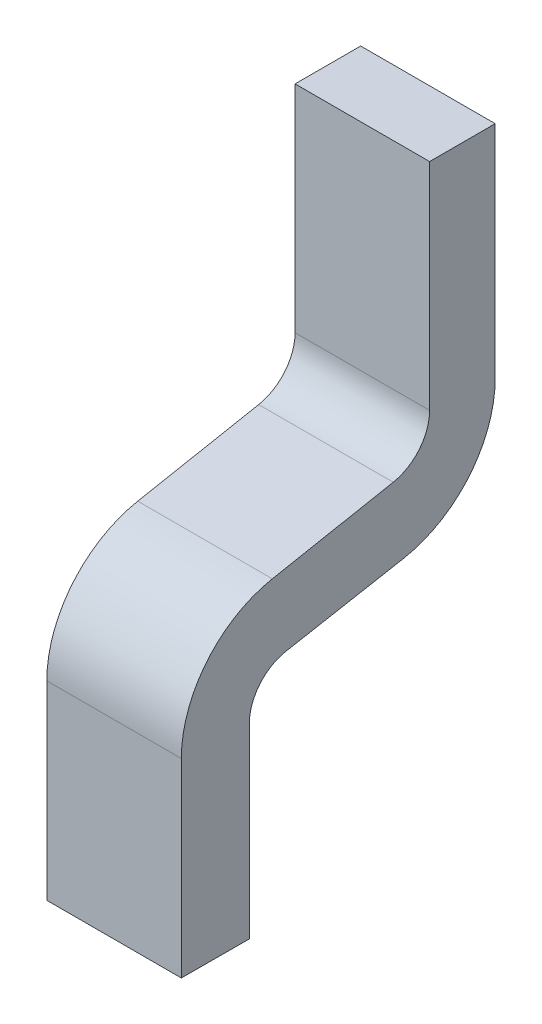
ISO-10303-21;
HEADER;
FILE_DESCRIPTION(('STEP AP214'),'2;1');
FILE_NAME('part.step','',(''),(''),'','','');
FILE_SCHEMA(('AUTOMOTIVE_DESIGN { 1 0 10303 214 1 1 1 1 }'));
ENDSEC;
DATA;
#1=APPLICATION_CONTEXT('core data for automotive mechanical design processes');
#2=APPLICATION_PROTOCOL_DEFINITION('international standard','automotive_design',2000,#1);
#3=PRODUCT_CONTEXT('',#1,'mechanical');
#4=PRODUCT('Part','Part','',(#3));
#5=PRODUCT_RELATED_PRODUCT_CATEGORY('part','',(#4));
#6=PRODUCT_DEFINITION_FORMATION('','',#4);
#7=PRODUCT_DEFINITION_CONTEXT('part definition',#1,'design');
#8=PRODUCT_DEFINITION('design','',#6,#7);
#9=PRODUCT_DEFINITION_SHAPE('','',#8);
#10=(LENGTH_UNIT() NAMED_UNIT(*) SI_UNIT(.MILLI.,.METRE.));
#11=(NAMED_UNIT(*) PLANE_ANGLE_UNIT() SI_UNIT($,.RADIAN.));
#12=(NAMED_UNIT(*) SI_UNIT($,.STERADIAN.) SOLID_ANGLE_UNIT());
#13=UNCERTAINTY_MEASURE_WITH_UNIT(LENGTH_MEASURE(1.E-05),#10,'distance_accuracy_value','');
#14=(GEOMETRIC_REPRESENTATION_CONTEXT(3) GLOBAL_UNCERTAINTY_ASSIGNED_CONTEXT((#13)) GLOBAL_UNIT_ASSIGNED_CONTEXT((#10,
#11,#12)) REPRESENTATION_CONTEXT('',''));
#15=CARTESIAN_POINT('',(0.,0.,0.));
#16=DIRECTION('',(0.,0.,1.));
#17=DIRECTION('',(1.,0.,0.));
#18=AXIS2_PLACEMENT_3D('',#15,#16,#17);
#19=CARTESIAN_POINT('',(-18.50784701318,-12.60762751016,-0.360872498583902));
#20=DIRECTION('',(1.,0.,0.));
#21=DIRECTION('',(0.,1.,0.));
#22=AXIS2_PLACEMENT_3D('',#19,#20,#21);
#23=PLANE('',#22);
#24=DIRECTION('',(0.,1.,0.));
#25=VECTOR('',#24,1.);
#26=CARTESIAN_POINT('',(-18.50784701319,-13.25000000001,0.));
#27=LINE('',#26,#25);
#28=CARTESIAN_POINT('',(-18.50784701318,-13.25,0.));
#29=VERTEX_POINT('',#28);
#30=CARTESIAN_POINT('',(-18.50784701318,-12.82603681334,0.));
#31=VERTEX_POINT('',#30);
#32=EDGE_CURVE('E39',#29,#31,#27,.T.);
#33=ORIENTED_EDGE('',*,*,#32,.F.);
#34=DIRECTION('',(0.,-0.00269129326266288,-0.999996378463729));
#35=VECTOR('',#34,1.);
#36=CARTESIAN_POINT('',(-18.50784701319,-13.25000000001,0.));
#37=LINE('',#36,#35);
#38=CARTESIAN_POINT('',(-18.50784701318,-13.25040851671,-0.151791423887201));
#39=VERTEX_POINT('',#38);
#40=EDGE_CURVE('E11',#29,#39,#37,.T.);
#41=ORIENTED_EDGE('',*,*,#40,.T.);
#42=DIRECTION('',(0.,-1.,0.));
#43=VECTOR('',#42,1.);
#44=CARTESIAN_POINT('',(-18.50784701319,-12.83394015019,-0.1517914238972));
#45=LINE('',#44,#43);
#46=CARTESIAN_POINT('',(-18.50784701318,-12.83394015018,-0.151791423887201));
#47=VERTEX_POINT('',#46);
#48=EDGE_CURVE('E194',#47,#39,#45,.T.);
#49=ORIENTED_EDGE('',*,*,#48,.F.);
#50=CARTESIAN_POINT('',(-18.50784701319,-12.83394015019,-0.251791423897203));
#51=DIRECTION('',(-1.,0.,0.));
#52=DIRECTION('',(0.,-1.00017763558392E-10,1.));
#53=AXIS2_PLACEMENT_3D('',#50,#51,#52);
#54=CIRCLE('',#53,0.10000000001);
#55=CARTESIAN_POINT('',(-18.50784701318,-12.73558330985,-0.2337378380948));
#56=VERTEX_POINT('',#55);
#57=EDGE_CURVE('E27',#47,#56,#54,.T.);
#58=ORIENTED_EDGE('',*,*,#57,.T.);
#59=DIRECTION('',(0.,0.180535857958628,-0.983568403310691));
#60=VECTOR('',#59,1.);
#61=CARTESIAN_POINT('',(-18.50784701319,-12.73558330986,-0.2337378381045));
#62=LINE('',#61,#60);
#63=CARTESIAN_POINT('',(-18.50784701318,-12.68760355188,-0.495133964482499));
#64=VERTEX_POINT('',#63);
#65=EDGE_CURVE('E214',#56,#64,#62,.T.);
#66=ORIENTED_EDGE('',*,*,#65,.T.);
#67=CARTESIAN_POINT('',(-18.50784701319,-12.44171145106,-0.450000000010001));
#68=DIRECTION('',(1.,0.,0.));
#69=DIRECTION('',(0.,-0.983568403309632,-0.180535857964399));
#70=AXIS2_PLACEMENT_3D('',#67,#68,#69);
#71=CIRCLE('',#70,0.250000000011641);
#72=CARTESIAN_POINT('',(-18.50784701318,-12.44171145105,-0.699999999999999));
#73=VERTEX_POINT('',#72);
#74=EDGE_CURVE('E20',#64,#73,#71,.T.);
#75=ORIENTED_EDGE('',*,*,#74,.T.);
#76=DIRECTION('',(0.,-1.,0.));
#77=VECTOR('',#76,1.);
#78=CARTESIAN_POINT('',(-18.50784701319,-11.95000000001,-0.700000000010002));
#79=LINE('',#78,#77);
#80=CARTESIAN_POINT('',(-18.50784701318,-11.95,-0.699999999999999));
#81=VERTEX_POINT('',#80);
#82=EDGE_CURVE('E144',#81,#73,#79,.T.);
#83=ORIENTED_EDGE('',*,*,#82,.F.);
#84=DIRECTION('',(0.,0.,-1.));
#85=VECTOR('',#84,1.);
#86=CARTESIAN_POINT('',(-18.50784701319,-11.95000000001,-0.553700885222302));
#87=LINE('',#86,#85);
#88=CARTESIAN_POINT('',(-18.50784701318,-11.95,-0.5537008852123));
#89=VERTEX_POINT('',#88);
#90=EDGE_CURVE('E125',#89,#81,#87,.T.);
#91=ORIENTED_EDGE('',*,*,#90,.F.);
#92=DIRECTION('',(0.,1.,0.));
#93=VECTOR('',#92,1.);
#94=CARTESIAN_POINT('',(-18.50784701319,-12.43058530158,-0.553700885222302));
#95=LINE('',#94,#93);
#96=CARTESIAN_POINT('',(-18.50784701318,-12.43058530157,-0.5537008852123));
#97=VERTEX_POINT('',#96);
#98=EDGE_CURVE('E133',#97,#89,#95,.T.);
#99=ORIENTED_EDGE('',*,*,#98,.F.);
#100=CARTESIAN_POINT('',(-18.50784701319,-12.43058530158,-0.4537008852223));
#101=DIRECTION('',(-1.,0.,0.));
#102=DIRECTION('',(0.,0.,-1.));
#103=AXIS2_PLACEMENT_3D('',#100,#101,#102);
#104=CIRCLE('',#103,0.10000000001);
#105=CARTESIAN_POINT('',(-18.50784701318,-12.52879504245,-0.472538262858001));
#106=VERTEX_POINT('',#105);
#107=EDGE_CURVE('E253',#97,#106,#104,.T.);
#108=ORIENTED_EDGE('',*,*,#107,.T.);
#109=DIRECTION('',(0.,-0.18837377648219,0.982097408780737));
#110=VECTOR('',#109,1.);
#111=CARTESIAN_POINT('',(-18.50784701319,-12.52879504246,-0.472538262867802));
#112=LINE('',#111,#110);
#113=CARTESIAN_POINT('',(-18.50784701318,-12.58051246114,-0.202906555886999));
#114=VERTEX_POINT('',#113);
#115=EDGE_CURVE('E180',#106,#114,#112,.T.);
#116=ORIENTED_EDGE('',*,*,#115,.T.);
#117=CARTESIAN_POINT('',(-18.50784701319,-12.82603681335,-0.250000000009999));
#118=DIRECTION('',(1.,0.,0.));
#119=DIRECTION('',(0.,0.982097408780527,0.188373776483282));
#120=AXIS2_PLACEMENT_3D('',#117,#118,#119);
#121=CIRCLE('',#120,0.250000000011705);
#122=EDGE_CURVE('E177',#114,#31,#121,.T.);
#123=ORIENTED_EDGE('',*,*,#122,.T.);
#124=EDGE_LOOP('',(#33,#41,#49,#58,#66,#75,#83,#91,#99,#108,#116,#123));
#125=FACE_BOUND('',#124,.T.);
#126=ADVANCED_FACE('F16',(#125),#23,.T.);
#127=CARTESIAN_POINT('',(-18.80784701318,-12.82603681334,-0.25));
#128=DIRECTION('',(1.,0.,0.));
#129=DIRECTION('',(0.,0.,-1.));
#130=AXIS2_PLACEMENT_3D('',#127,#128,#129);
#131=CYLINDRICAL_SURFACE('',#130,0.25);
#132=DIRECTION('',(1.,0.,0.));
#133=VECTOR('',#132,1.);
#134=CARTESIAN_POINT('',(-18.80784701319,-12.82603681335,0.));
#135=LINE('',#134,#133);
#136=CARTESIAN_POINT('',(-18.80784701318,-12.82603681334,0.));
#137=VERTEX_POINT('',#136);
#138=EDGE_CURVE('E181',#137,#31,#135,.T.);
#139=ORIENTED_EDGE('',*,*,#138,.T.);
#140=ORIENTED_EDGE('',*,*,#122,.F.);
#141=DIRECTION('',(-1.,-3.33570181025589E-11,3.3404665161552E-11));
#142=VECTOR('',#141,1.);
#143=CARTESIAN_POINT('',(-18.50784701319,-12.58051246115,-0.202906555896699));
#144=LINE('',#143,#142);
#145=CARTESIAN_POINT('',(-18.80784701318,-12.58051246114,-0.2029065558867));
#146=VERTEX_POINT('',#145);
#147=EDGE_CURVE('E185',#114,#146,#144,.T.);
#148=ORIENTED_EDGE('',*,*,#147,.T.);
#149=CARTESIAN_POINT('',(-18.80784701319,-12.82603681335,-0.250000000009999));
#150=DIRECTION('',(-1.,0.,0.));
#151=DIRECTION('',(0.,0.,1.));
#152=AXIS2_PLACEMENT_3D('',#149,#150,#151);
#153=CIRCLE('',#152,0.25000000001);
#154=EDGE_CURVE('E189',#137,#146,#153,.T.);
#155=ORIENTED_EDGE('',*,*,#154,.F.);
#156=EDGE_LOOP('',(#139,#140,#148,#155));
#157=FACE_BOUND('',#156,.T.);
#158=ADVANCED_FACE('F287',(#157),#131,.T.);
#159=CARTESIAN_POINT('',(-18.80784701318,-12.60762751016,-0.360872498583902));
#160=DIRECTION('',(1.,0.,0.));
#161=DIRECTION('',(0.,1.,0.));
#162=AXIS2_PLACEMENT_3D('',#159,#160,#161);
#163=PLANE('',#162);
#164=DIRECTION('',(0.,0.18837377648219,-0.982097408780737));
#165=VECTOR('',#164,1.);
#166=CARTESIAN_POINT('',(-18.80784701319,-12.58051246115,-0.202906555896699));
#167=LINE('',#166,#165);
#168=CARTESIAN_POINT('',(-18.80784701318,-12.52879504245,-0.4725382628578));
#169=VERTEX_POINT('',#168);
#170=EDGE_CURVE('E213',#146,#169,#167,.T.);
#171=ORIENTED_EDGE('',*,*,#170,.T.);
#172=CARTESIAN_POINT('',(-18.80784701319,-12.43058530158,-0.4537008852223));
#173=DIRECTION('',(1.,0.,0.));
#174=DIRECTION('',(0.,-0.982097408770884,-0.188373776533558));
#175=AXIS2_PLACEMENT_3D('',#172,#173,#174);
#176=CIRCLE('',#175,0.100000000011705);
#177=CARTESIAN_POINT('',(-18.80784701318,-12.43058530157,-0.5537008852123));
#178=VERTEX_POINT('',#177);
#179=EDGE_CURVE('E204',#169,#178,#176,.T.);
#180=ORIENTED_EDGE('',*,*,#179,.T.);
#181=DIRECTION('',(0.,1.,0.));
#182=VECTOR('',#181,1.);
#183=CARTESIAN_POINT('',(-18.80784701319,-12.43058530158,-0.553700885222302));
#184=LINE('',#183,#182);
#185=CARTESIAN_POINT('',(-18.80784701318,-11.95,-0.5537008852123));
#186=VERTEX_POINT('',#185);
#187=EDGE_CURVE('E201',#178,#186,#184,.T.);
#188=ORIENTED_EDGE('',*,*,#187,.T.);
#189=DIRECTION('',(0.,0.,-1.));
#190=VECTOR('',#189,1.);
#191=CARTESIAN_POINT('',(-18.80784701319,-11.95000000001,-0.553700885222302));
#192=LINE('',#191,#190);
#193=CARTESIAN_POINT('',(-18.80784701318,-11.95,-0.699999999999999));
#194=VERTEX_POINT('',#193);
#195=EDGE_CURVE('E150',#186,#194,#192,.T.);
#196=ORIENTED_EDGE('',*,*,#195,.T.);
#197=DIRECTION('',(0.,-1.,0.));
#198=VECTOR('',#197,1.);
#199=CARTESIAN_POINT('',(-18.80784701319,-11.95000000001,-0.700000000010002));
#200=LINE('',#199,#198);
#201=CARTESIAN_POINT('',(-18.80784701318,-12.44171145105,-0.699999999999999));
#202=VERTEX_POINT('',#201);
#203=EDGE_CURVE('E176',#194,#202,#200,.T.);
#204=ORIENTED_EDGE('',*,*,#203,.T.);
#205=CARTESIAN_POINT('',(-18.80784701319,-12.44171145106,-0.450000000010001));
#206=DIRECTION('',(-1.,0.,0.));
#207=DIRECTION('',(0.,-4.00497379899013E-11,-1.));
#208=AXIS2_PLACEMENT_3D('',#205,#206,#207);
#209=CIRCLE('',#208,0.25000000001);
#210=CARTESIAN_POINT('',(-18.80784701318,-12.68760355188,-0.495133964482301));
#211=VERTEX_POINT('',#210);
#212=EDGE_CURVE('E171',#202,#211,#209,.T.);
#213=ORIENTED_EDGE('',*,*,#212,.T.);
#214=DIRECTION('',(0.,-0.180535857958628,0.983568403310691));
#215=VECTOR('',#214,1.);
#216=CARTESIAN_POINT('',(-18.80784701319,-12.68760355189,-0.4951339644923));
#217=LINE('',#216,#215);
#218=CARTESIAN_POINT('',(-18.80784701318,-12.73558330985,-0.233737838094203));
#219=VERTEX_POINT('',#218);
#220=EDGE_CURVE('E167',#211,#219,#217,.T.);
#221=ORIENTED_EDGE('',*,*,#220,.T.);
#222=CARTESIAN_POINT('',(-18.80784701319,-12.83394015019,-0.251791423897203));
#223=DIRECTION('',(1.,0.,0.));
#224=DIRECTION('',(0.,0.983568403301429,0.180535858009089));
#225=AXIS2_PLACEMENT_3D('',#222,#223,#224);
#226=CIRCLE('',#225,0.100000000011641);
#227=CARTESIAN_POINT('',(-18.80784701318,-12.83394015018,-0.151791423887201));
#228=VERTEX_POINT('',#227);
#229=EDGE_CURVE('E172',#219,#228,#226,.T.);
#230=ORIENTED_EDGE('',*,*,#229,.T.);
#231=DIRECTION('',(0.,-1.,0.));
#232=VECTOR('',#231,1.);
#233=CARTESIAN_POINT('',(-18.80784701319,-12.83394015019,-0.1517914238972));
#234=LINE('',#233,#232);
#235=CARTESIAN_POINT('',(-18.80784701318,-13.25040851671,-0.151791423887201));
#236=VERTEX_POINT('',#235);
#237=EDGE_CURVE('E165',#228,#236,#234,.T.);
#238=ORIENTED_EDGE('',*,*,#237,.T.);
#239=DIRECTION('',(0.,0.00269129326262788,0.999996378463729));
#240=VECTOR('',#239,1.);
#241=CARTESIAN_POINT('',(-18.80784701319,-13.25040851672,-0.1517914238972));
#242=LINE('',#241,#240);
#243=CARTESIAN_POINT('',(-18.80784701318,-13.25,0.));
#244=VERTEX_POINT('',#243);
#245=EDGE_CURVE('E161',#236,#244,#242,.T.);
#246=ORIENTED_EDGE('',*,*,#245,.T.);
#247=DIRECTION('',(0.,1.,0.));
#248=VECTOR('',#247,1.);
#249=CARTESIAN_POINT('',(-18.80784701319,-13.25000000001,0.));
#250=LINE('',#249,#248);
#251=EDGE_CURVE('E166',#244,#137,#250,.T.);
#252=ORIENTED_EDGE('',*,*,#251,.T.);
#253=ORIENTED_EDGE('',*,*,#154,.T.);
#254=EDGE_LOOP('',(#171,#180,#188,#196,#204,#213,#221,#230,#238,#246,#252,#253));
#255=FACE_BOUND('',#254,.T.);
#256=ADVANCED_FACE('F273',(#255),#163,.F.);
#257=CARTESIAN_POINT('',(-18.80784701318,-13.03801840667,0.));
#258=DIRECTION('',(0.,0.,-1.));
#259=DIRECTION('',(0.,-1.,0.));
#260=AXIS2_PLACEMENT_3D('',#257,#258,#259);
#261=PLANE('',#260);
#262=ORIENTED_EDGE('',*,*,#251,.F.);
#263=DIRECTION('',(1.,3.34162298526453E-11,0.));
#264=VECTOR('',#263,1.);
#265=CARTESIAN_POINT('',(-18.80784701319,-13.25000000001,0.));
#266=LINE('',#265,#264);
#267=EDGE_CURVE('E198',#244,#29,#266,.T.);
#268=ORIENTED_EDGE('',*,*,#267,.T.);
#269=ORIENTED_EDGE('',*,*,#32,.T.);
#270=ORIENTED_EDGE('',*,*,#138,.F.);
#271=EDGE_LOOP('',(#262,#268,#269,#270));
#272=FACE_BOUND('',#271,.T.);
#273=ADVANCED_FACE('F309',(#272),#261,.F.);
#274=CARTESIAN_POINT('',(-18.80784701318,-13.25020425835,-0.0758957119436077));
#275=DIRECTION('',(0.,0.999996378463906,-0.00269129319701602));
#276=DIRECTION('',(-1.,0.,0.));
#277=AXIS2_PLACEMENT_3D('',#274,#275,#276);
#278=PLANE('',#277);
#279=ORIENTED_EDGE('',*,*,#245,.F.);
#280=DIRECTION('',(-1.,-3.34043873291556E-11,0.));
#281=VECTOR('',#280,1.);
#282=CARTESIAN_POINT('',(-18.50784701319,-13.25040851672,-0.1517914238972));
#283=LINE('',#282,#281);
#284=EDGE_CURVE('E190',#39,#236,#283,.T.);
#285=ORIENTED_EDGE('',*,*,#284,.F.);
#286=ORIENTED_EDGE('',*,*,#40,.F.);
#287=ORIENTED_EDGE('',*,*,#267,.F.);
#288=EDGE_LOOP('',(#279,#285,#286,#287));
#289=FACE_BOUND('',#288,.T.);
#290=ADVANCED_FACE('F18',(#289),#278,.F.);
#291=CARTESIAN_POINT('',(-18.80784701318,-13.04217433344,-0.151791423887201));
#292=DIRECTION('',(0.,0.,1.));
#293=DIRECTION('',(1.,0.,0.));
#294=AXIS2_PLACEMENT_3D('',#291,#292,#293);
#295=PLANE('',#294);
#296=ORIENTED_EDGE('',*,*,#237,.F.);
#297=DIRECTION('',(-1.,0.,0.));
#298=VECTOR('',#297,1.);
#299=CARTESIAN_POINT('',(-18.50784701319,-12.83394015019,-0.1517914238972));
#300=LINE('',#299,#298);
#301=EDGE_CURVE('E235',#47,#228,#300,.T.);
#302=ORIENTED_EDGE('',*,*,#301,.F.);
#303=ORIENTED_EDGE('',*,*,#48,.T.);
#304=ORIENTED_EDGE('',*,*,#284,.T.);
#305=EDGE_LOOP('',(#296,#302,#303,#304));
#306=FACE_BOUND('',#305,.T.);
#307=ADVANCED_FACE('F300',(#306),#295,.F.);
#308=CARTESIAN_POINT('',(-18.80784701318,-12.83394015018,-0.251791423887197));
#309=DIRECTION('',(1.,0.,0.));
#310=DIRECTION('',(0.,0.,-1.));
#311=AXIS2_PLACEMENT_3D('',#308,#309,#310);
#312=CYLINDRICAL_SURFACE('',#311,0.1);
#313=ORIENTED_EDGE('',*,*,#229,.F.);
#314=DIRECTION('',(1.,3.35109687395196E-11,-3.39381273248667E-11));
#315=VECTOR('',#314,1.);
#316=CARTESIAN_POINT('',(-18.80784701319,-12.73558330986,-0.233737838104299));
#317=LINE('',#316,#315);
#318=EDGE_CURVE('E195',#219,#56,#317,.T.);
#319=ORIENTED_EDGE('',*,*,#318,.T.);
#320=ORIENTED_EDGE('',*,*,#57,.F.);
#321=ORIENTED_EDGE('',*,*,#301,.T.);
#322=EDGE_LOOP('',(#313,#319,#320,#321));
#323=FACE_BOUND('',#322,.T.);
#324=ADVANCED_FACE('F302',(#323),#312,.F.);
#325=CARTESIAN_POINT('',(-18.80784701318,-12.71159343087,-0.364435901288301));
#326=DIRECTION('',(0.,0.983568403316128,0.180535857929005));
#327=DIRECTION('',(1.,0.,0.));
#328=AXIS2_PLACEMENT_3D('',#325,#326,#327);
#329=PLANE('',#328);
#330=ORIENTED_EDGE('',*,*,#220,.F.);
#331=DIRECTION('',(-1.,-3.35168902181049E-11,3.40081638940011E-11));
#332=VECTOR('',#331,1.);
#333=CARTESIAN_POINT('',(-18.50784701319,-12.68760355189,-0.495133964492502));
#334=LINE('',#333,#332);
#335=EDGE_CURVE('E207',#64,#211,#334,.T.);
#336=ORIENTED_EDGE('',*,*,#335,.F.);
#337=ORIENTED_EDGE('',*,*,#65,.F.);
#338=ORIENTED_EDGE('',*,*,#318,.F.);
#339=EDGE_LOOP('',(#330,#336,#337,#338));
#340=FACE_BOUND('',#339,.T.);
#341=ADVANCED_FACE('F269',(#340),#329,.F.);
#342=CARTESIAN_POINT('',(-18.80784701318,-12.44171145105,-0.449999999999999));
#343=DIRECTION('',(1.,0.,0.));
#344=DIRECTION('',(0.,0.,-1.));
#345=AXIS2_PLACEMENT_3D('',#342,#343,#344);
#346=CYLINDRICAL_SURFACE('',#345,0.25);
#347=DIRECTION('',(1.,0.,0.));
#348=VECTOR('',#347,1.);
#349=CARTESIAN_POINT('',(-18.80784701319,-12.44171145106,-0.700000000010002));
#350=LINE('',#349,#348);
#351=EDGE_CURVE('E238',#202,#73,#350,.T.);
#352=ORIENTED_EDGE('',*,*,#351,.T.);
#353=ORIENTED_EDGE('',*,*,#74,.F.);
#354=ORIENTED_EDGE('',*,*,#335,.T.);
#355=ORIENTED_EDGE('',*,*,#212,.F.);
#356=EDGE_LOOP('',(#352,#353,#354,#355));
#357=FACE_BOUND('',#356,.T.);
#358=ADVANCED_FACE('F267',(#357),#346,.T.);
#359=CARTESIAN_POINT('',(-18.80784701318,-12.19585572553,-0.699999999999999));
#360=DIRECTION('',(0.,0.,1.));
#361=DIRECTION('',(1.,0.,0.));
#362=AXIS2_PLACEMENT_3D('',#359,#360,#361);
#363=PLANE('',#362);
#364=ORIENTED_EDGE('',*,*,#203,.F.);
#365=DIRECTION('',(-1.,0.,0.));
#366=VECTOR('',#365,1.);
#367=CARTESIAN_POINT('',(-18.50784701319,-11.95000000001,-0.700000000010002));
#368=LINE('',#367,#366);
#369=EDGE_CURVE('E141',#81,#194,#368,.T.);
#370=ORIENTED_EDGE('',*,*,#369,.F.);
#371=ORIENTED_EDGE('',*,*,#82,.T.);
#372=ORIENTED_EDGE('',*,*,#351,.F.);
#373=EDGE_LOOP('',(#364,#370,#371,#372));
#374=FACE_BOUND('',#373,.T.);
#375=ADVANCED_FACE('F275',(#374),#363,.F.);
#376=CARTESIAN_POINT('',(-18.80784701318,-11.95,-0.626850442606099));
#377=DIRECTION('',(0.,-1.,0.));
#378=DIRECTION('',(0.,0.,-1.));
#379=AXIS2_PLACEMENT_3D('',#376,#377,#378);
#380=PLANE('',#379);
#381=ORIENTED_EDGE('',*,*,#195,.F.);
#382=DIRECTION('',(-1.,0.,0.));
#383=VECTOR('',#382,1.);
#384=CARTESIAN_POINT('',(-18.50784701319,-11.95000000001,-0.553700885222302));
#385=LINE('',#384,#383);
#386=EDGE_CURVE('E135',#89,#186,#385,.T.);
#387=ORIENTED_EDGE('',*,*,#386,.F.);
#388=ORIENTED_EDGE('',*,*,#90,.T.);
#389=ORIENTED_EDGE('',*,*,#369,.T.);
#390=EDGE_LOOP('',(#381,#387,#388,#389));
#391=FACE_BOUND('',#390,.T.);
#392=ADVANCED_FACE('F148',(#391),#380,.F.);
#393=CARTESIAN_POINT('',(-18.80784701318,-12.19029265078,-0.5537008852123));
#394=DIRECTION('',(0.,0.,-1.));
#395=DIRECTION('',(0.,-1.,0.));
#396=AXIS2_PLACEMENT_3D('',#393,#394,#395);
#397=PLANE('',#396);
#398=ORIENTED_EDGE('',*,*,#187,.F.);
#399=DIRECTION('',(-1.,0.,0.));
#400=VECTOR('',#399,1.);
#401=CARTESIAN_POINT('',(-18.50784701319,-12.43058530158,-0.553700885222302));
#402=LINE('',#401,#400);
#403=EDGE_CURVE('E137',#97,#178,#402,.T.);
#404=ORIENTED_EDGE('',*,*,#403,.F.);
#405=ORIENTED_EDGE('',*,*,#98,.T.);
#406=ORIENTED_EDGE('',*,*,#386,.T.);
#407=EDGE_LOOP('',(#398,#404,#405,#406));
#408=FACE_BOUND('',#407,.T.);
#409=ADVANCED_FACE('F134',(#408),#397,.F.);
#410=CARTESIAN_POINT('',(-18.80784701318,-12.43058530157,-0.453700885212301));
#411=DIRECTION('',(1.,0.,0.));
#412=DIRECTION('',(0.,0.,-1.));
#413=AXIS2_PLACEMENT_3D('',#410,#411,#412);
#414=CYLINDRICAL_SURFACE('',#413,0.1);
#415=ORIENTED_EDGE('',*,*,#179,.F.);
#416=DIRECTION('',(1.,3.33925452393469E-11,-3.35117091648394E-11));
#417=VECTOR('',#416,1.);
#418=CARTESIAN_POINT('',(-18.80784701319,-12.52879504246,-0.472538262867701));
#419=LINE('',#418,#417);
#420=EDGE_CURVE('E153',#169,#106,#419,.T.);
#421=ORIENTED_EDGE('',*,*,#420,.T.);
#422=ORIENTED_EDGE('',*,*,#107,.F.);
#423=ORIENTED_EDGE('',*,*,#403,.T.);
#424=EDGE_LOOP('',(#415,#421,#422,#423));
#425=FACE_BOUND('',#424,.T.);
#426=ADVANCED_FACE('F298',(#425),#414,.F.);
#427=CARTESIAN_POINT('',(-18.80784701318,-12.55465375179,-0.337722409372097));
#428=DIRECTION('',(0.,-0.982097408786183,-0.188373776453796));
#429=DIRECTION('',(0.,0.188373776453797,-0.982097408786183));
#430=AXIS2_PLACEMENT_3D('',#427,#428,#429);
#431=PLANE('',#430);
#432=ORIENTED_EDGE('',*,*,#170,.F.);
#433=ORIENTED_EDGE('',*,*,#147,.F.);
#434=ORIENTED_EDGE('',*,*,#115,.F.);
#435=ORIENTED_EDGE('',*,*,#420,.F.);
#436=EDGE_LOOP('',(#432,#433,#434,#435));
#437=FACE_BOUND('',#436,.T.);
#438=ADVANCED_FACE('F296',(#437),#431,.F.);
#439=CLOSED_SHELL('',(#126,#158,#256,#273,#290,#307,#324,#341,#358,#375,#392,#409,#426,#438));
#440=MANIFOLD_SOLID_BREP('B1',#439);
#441=ADVANCED_BREP_SHAPE_REPRESENTATION('',(#18,#440),#14);
#442=SHAPE_DEFINITION_REPRESENTATION(#9,#441);
ENDSEC;
END-ISO-10303-21;
